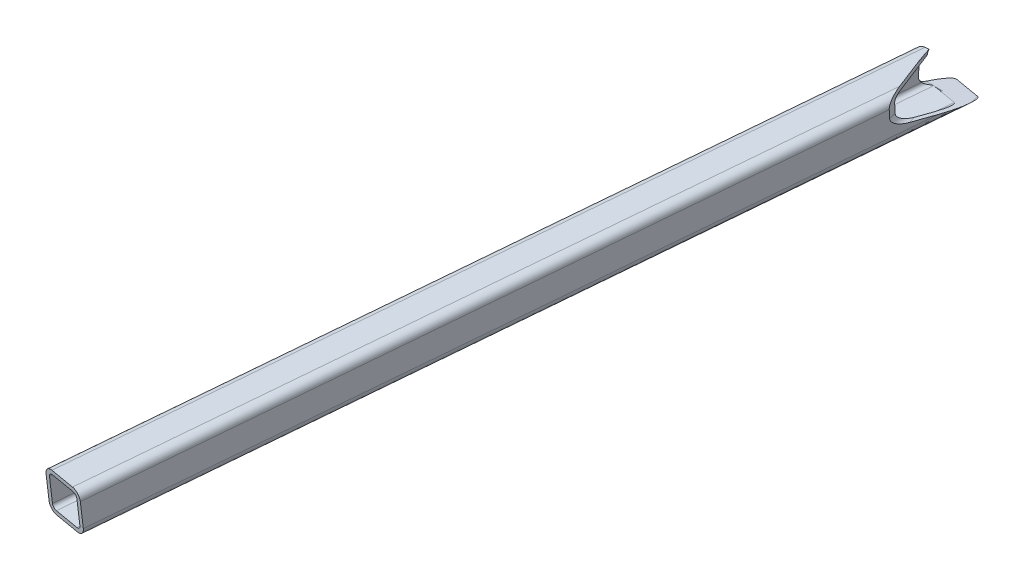
ISO-10303-21;
HEADER;
FILE_DESCRIPTION(('STEP AP214'),'2;1');
FILE_NAME('part.step','',(''),(''),'','','');
FILE_SCHEMA(('AUTOMOTIVE_DESIGN { 1 0 10303 214 1 1 1 1 }'));
ENDSEC;
DATA;
#1=APPLICATION_CONTEXT('core data for automotive mechanical design processes');
#2=APPLICATION_PROTOCOL_DEFINITION('international standard','automotive_design',2000,#1);
#3=PRODUCT_CONTEXT('',#1,'mechanical');
#4=PRODUCT('Part','Part','',(#3));
#5=PRODUCT_RELATED_PRODUCT_CATEGORY('part','',(#4));
#6=PRODUCT_DEFINITION_FORMATION('','',#4);
#7=PRODUCT_DEFINITION_CONTEXT('part definition',#1,'design');
#8=PRODUCT_DEFINITION('design','',#6,#7);
#9=PRODUCT_DEFINITION_SHAPE('','',#8);
#10=(LENGTH_UNIT() NAMED_UNIT(*) SI_UNIT(.MILLI.,.METRE.));
#11=(NAMED_UNIT(*) PLANE_ANGLE_UNIT() SI_UNIT($,.RADIAN.));
#12=(NAMED_UNIT(*) SI_UNIT($,.STERADIAN.) SOLID_ANGLE_UNIT());
#13=UNCERTAINTY_MEASURE_WITH_UNIT(LENGTH_MEASURE(1.E-05),#10,'distance_accuracy_value','');
#14=(GEOMETRIC_REPRESENTATION_CONTEXT(3) GLOBAL_UNCERTAINTY_ASSIGNED_CONTEXT((#13)) GLOBAL_UNIT_ASSIGNED_CONTEXT((#10,
#11,#12)) REPRESENTATION_CONTEXT('',''));
#15=CARTESIAN_POINT('',(0.,0.,0.));
#16=DIRECTION('',(0.,0.,1.));
#17=DIRECTION('',(1.,0.,0.));
#18=AXIS2_PLACEMENT_3D('',#15,#16,#17);
#19=CARTESIAN_POINT('',(54.1032900351574,-73.9281460624986,-1680.60116665924));
#20=DIRECTION('',(0.3292103133934,0.229015870186713,-0.916063480746854));
#21=DIRECTION('',(-0.941074716280074,0.,-0.338198726163152));
#22=AXIS2_PLACEMENT_3D('',#19,#20,#21);
#23=CYLINDRICAL_SURFACE('',#22,4.);
#24=CARTESIAN_POINT('',(165.293495766993,3.42156227269108,-1990.));
#25=DIRECTION('',(0.,0.,-1.));
#26=DIRECTION('',(0.820905201785488,0.5710644881986,0.));
#27=AXIS2_PLACEMENT_3D('',#24,#25,#26);
#28=ELLIPSE('',#27,4.36650961867715,4.);
#29=CARTESIAN_POINT('',(161.046510304216,3.24974629858509,-1990.));
#30=VERTEX_POINT('',#29);
#31=CARTESIAN_POINT('',(162.205924152796,6.00000000000001,-1990.));
#32=VERTEX_POINT('',#31);
#33=EDGE_CURVE('E529',#30,#32,#28,.T.);
#34=ORIENTED_EDGE('',*,*,#33,.F.);
#35=DIRECTION('',(0.3292103133934,0.229015870186713,-0.916063480746854));
#36=VECTOR('',#35,1.);
#37=CARTESIAN_POINT('',(50.3295443978832,-73.7707517232112,-1681.91800791281));
#38=LINE('',#37,#36);
#39=CARTESIAN_POINT('',(49.9999999999999,-73.9999999999996,-1681.00101480566));
#40=VERTEX_POINT('',#39);
#41=EDGE_CURVE('E271',#40,#30,#38,.T.);
#42=ORIENTED_EDGE('',*,*,#41,.F.);
#43=CARTESIAN_POINT('',(53.9999999999999,-73.9999999999996,-1680.31375090924));
#44=DIRECTION('',(-0.168171921974834,-0.116989163112928,0.978790958465303));
#45=DIRECTION('',(0.80349458926477,0.558952757749405,0.204861562101272));
#46=AXIS2_PLACEMENT_3D('',#43,#44,#45);
#47=ELLIPSE('',#46,4.08667444810873,4.);
#48=CARTESIAN_POINT('',(54.,-69.9999999999996,-1679.83565428564));
#49=VERTEX_POINT('',#48);
#50=EDGE_CURVE('E310',#49,#40,#47,.T.);
#51=ORIENTED_EDGE('',*,*,#50,.F.);
#52=DIRECTION('',(0.3292103133934,0.229015870186713,-0.916063480746854));
#53=VECTOR('',#52,1.);
#54=CARTESIAN_POINT('',(53.94589569587,-70.0376377767856,-1679.68510317849));
#55=LINE('',#54,#53);
#56=CARTESIAN_POINT('',(165.589697193477,7.62761543894062,-1990.3461160414));
#57=VERTEX_POINT('',#56);
#58=EDGE_CURVE('E274',#49,#57,#55,.T.);
#59=ORIENTED_EDGE('',*,*,#58,.T.);
#60=CARTESIAN_POINT('',(162.205924152796,6.00000000000001,-1990.));
#61=CARTESIAN_POINT('',(162.297465743592,6.10076571228071,-1990.00003387805));
#62=CARTESIAN_POINT('',(162.393493529026,6.19723632581698,-1990.00380646283));
#63=CARTESIAN_POINT('',(162.593031896537,6.38134727203628,-1990.01714341719));
#64=CARTESIAN_POINT('',(162.696529720715,6.4690020755013,-1990.02669810857));
#65=CARTESIAN_POINT('',(162.910387881736,6.6360115786466,-1990.04998536255));
#66=CARTESIAN_POINT('',(163.020781119878,6.71532072401796,-1990.06373940216));
#67=CARTESIAN_POINT('',(163.247124091024,6.86509701663771,-1990.09392167442));
#68=CARTESIAN_POINT('',(163.363076368465,6.93556006048673,-1990.11035114006));
#69=CARTESIAN_POINT('',(163.599098139199,7.06701379623975,-1990.14434717654));
#70=CARTESIAN_POINT('',(163.719137329081,7.12806100180455,-1990.16190598873));
#71=CARTESIAN_POINT('',(163.963541515791,7.24085913002823,-1990.19687569133));
#72=CARTESIAN_POINT('',(164.087906663519,7.29260972800839,-1990.21428657657));
#73=CARTESIAN_POINT('',(164.34001675291,7.3860288925307,-1990.2474845087));
#74=CARTESIAN_POINT('',(164.467746101468,7.42773714489657,-1990.26327780088));
#75=CARTESIAN_POINT('',(164.726489803195,7.50045626921022,-1990.29187946547));
#76=CARTESIAN_POINT('',(164.857501843146,7.53147445869022,-1990.30468987776));
#77=CARTESIAN_POINT('',(165.088591864016,7.57535323428185,-1990.32322337915));
#78=CARTESIAN_POINT('',(165.188095803454,7.59082324756153,-1990.3299198235));
#79=CARTESIAN_POINT('',(165.388208205971,7.61467927402099,-1990.34036302645));
#80=CARTESIAN_POINT('',(165.488817782183,7.62305732658316,-1990.34410647004));
#81=CARTESIAN_POINT('',(165.589697193477,7.62761543894065,-1990.3461160414));
#82=B_SPLINE_CURVE_WITH_KNOTS('',3,(#60,#61,#62,#63,#64,#65,#66,#67,#68,#69,#70,#71,#72,#73,#74,
#75,#76,#77,#78,#79,#80,#81),.UNSPECIFIED.,.F.,.F.,(4,2,2,2,2,2,2,2,2,2,4),(0.,
0.407989495698475,0.815297972147628,1.22472549541881,1.63434224163021,2.04139583532084,
2.44846364236362,2.85389535824419,3.2590489953317,3.56153390662927,3.86435790407479),.UNSPECIFIED.);
#83=EDGE_CURVE('E361',#32,#57,#82,.T.);
#84=ORIENTED_EDGE('',*,*,#83,.F.);
#85=EDGE_LOOP('',(#34,#42,#51,#59,#84));
#86=FACE_BOUND('',#85,.T.);
#87=ADVANCED_FACE('F41',(#86),#23,.T.);
#88=CARTESIAN_POINT('',(50.8017274157454,-85.4422765803505,-1684.66619835505));
#89=DIRECTION('',(0.943436409318581,-0.0393485848218571,0.329210313393401));
#90=DIRECTION('',(0.329465469723453,0.,-0.944167625085665));
#91=AXIS2_PLACEMENT_3D('',#88,#89,#90);
#92=PLANE('',#91);
#93=CARTESIAN_POINT('',(162.056516720495,-6.00000000000001,-1994.));
#94=DIRECTION('',(0.943436409318581,-0.0393485848218571,0.329210313393401));
#95=DIRECTION('',(-0.33155352746135,-0.111966498623447,0.936768787702676));
#96=AXIS2_PLACEMENT_3D('',#93,#94,#95);
#97=ELLIPSE('',#96,4.23981940965062,4.);
#98=CARTESIAN_POINT('',(160.948514442533,-8.81842473562879,-1991.16160573394));
#99=VERTEX_POINT('',#98);
#100=CARTESIAN_POINT('',(160.660724443912,-6.00000000000001,-1990.));
#101=VERTEX_POINT('',#100);
#102=EDGE_CURVE('E282',#99,#101,#97,.F.);
#103=ORIENTED_EDGE('',*,*,#102,.F.);
#104=DIRECTION('',(0.3292103133934,0.229015870186713,-0.916063480746854));
#105=VECTOR('',#104,1.);
#106=CARTESIAN_POINT('',(50.8017274157454,-85.4422765803505,-1684.66619835505));
#107=LINE('',#106,#105);
#108=CARTESIAN_POINT('',(50.,-85.9999999999995,-1682.43530467646));
#109=VERTEX_POINT('',#108);
#110=EDGE_CURVE('E268',#109,#99,#107,.T.);
#111=ORIENTED_EDGE('',*,*,#110,.F.);
#112=DIRECTION('',(0.,-0.992932622114171,-0.118679433523578));
#113=VECTOR('',#112,1.);
#114=CARTESIAN_POINT('',(50.,-85.7130220381919,-1682.40100387781));
#115=LINE('',#114,#113);
#116=EDGE_CURVE('E313',#40,#109,#115,.T.);
#117=ORIENTED_EDGE('',*,*,#116,.F.);
#118=ORIENTED_EDGE('',*,*,#41,.T.);
#119=DIRECTION('',(0.0416714946710183,0.999131366003432,0.));
#120=VECTOR('',#119,1.);
#121=CARTESIAN_POINT('',(157.162350004895,-89.8783360098117,-1990.));
#122=LINE('',#121,#120);
#123=EDGE_CURVE('E530',#101,#30,#122,.T.);
#124=ORIENTED_EDGE('',*,*,#123,.F.);
#125=EDGE_LOOP('',(#103,#111,#117,#118,#124));
#126=FACE_BOUND('',#125,.T.);
#127=ADVANCED_FACE('F357',(#126),#92,.F.);
#128=CARTESIAN_POINT('',(54.5754730530198,-85.599670919638,-1683.34935710148));
#129=DIRECTION('',(0.3292103133934,0.229015870186713,-0.916063480746854));
#130=DIRECTION('',(-0.941074716280074,0.,-0.338198726163152));
#131=AXIS2_PLACEMENT_3D('',#128,#129,#130);
#132=CYLINDRICAL_SURFACE('',#131,4.);
#133=CARTESIAN_POINT('',(162.373354768369,-10.,-1994.));
#134=CARTESIAN_POINT('',(162.312482268875,-9.99996135996605,-1993.87489935749));
#135=CARTESIAN_POINT('',(162.249658701786,-9.99413083001994,-1993.75081611515));
#136=CARTESIAN_POINT('',(162.12173329001,-9.97116634251973,-1993.5048445865));
#137=CARTESIAN_POINT('',(162.056630920958,-9.95402976696814,-1993.38295681528));
#138=CARTESIAN_POINT('',(161.924963897282,-9.90844383026138,-1993.14004928697));
#139=CARTESIAN_POINT('',(161.85839119264,-9.87985242714997,-1993.01906062743));
#140=CARTESIAN_POINT('',(161.726361952706,-9.81136374272717,-1992.77975927288));
#141=CARTESIAN_POINT('',(161.660905134617,-9.77146937244744,-1992.66144589734));
#142=CARTESIAN_POINT('',(161.498933104692,-9.65594730864718,-1992.36568495085));
#143=CARTESIAN_POINT('',(161.40433895344,-9.57258646007895,-1992.19012216393));
#144=CARTESIAN_POINT('',(161.230119248568,-9.37787345788967,-1991.8486771634));
#145=CARTESIAN_POINT('',(161.150391651847,-9.26672538979076,-1991.68273478606));
#146=CARTESIAN_POINT('',(161.056233979188,-9.09179670783814,-1991.46088297955));
#147=CARTESIAN_POINT('',(161.031590058566,-9.0403446638256,-1991.39945882488));
#148=CARTESIAN_POINT('',(160.986611280392,-8.93282345818923,-1991.27876866423));
#149=CARTESIAN_POINT('',(160.966289964395,-8.87674052937456,-1991.21950990842));
#150=CARTESIAN_POINT('',(160.948514442533,-8.81842473562867,-1991.16160573394));
#151=B_SPLINE_CURVE_WITH_KNOTS('',3,(#133,#134,#135,#136,#137,#138,#139,#140,#141,#142,#143,
#144,#145,#146,#147,#148,#149,#150),.UNSPECIFIED.,.F.,.F.,(4,2,2,2,2,2,2,2,4),(0.,
0.417149501995803,0.834395631925087,1.25698427573216,1.67946418239054,2.32580539550081,
2.9675322218104,3.21879294818066,3.47082957732747),.UNSPECIFIED.);
#152=CARTESIAN_POINT('',(162.373354768369,-10.,-1994.));
#153=VERTEX_POINT('',#152);
#154=EDGE_CURVE('E422',#153,#99,#151,.T.);
#155=ORIENTED_EDGE('',*,*,#154,.F.);
#156=CARTESIAN_POINT('',(163.249999999999,-10.,-1985.74804078003));
#157=DIRECTION('',(0.,1.,0.));
#158=DIRECTION('',(0.338198726163151,0.,-0.941074716280074));
#159=AXIS2_PLACEMENT_3D('',#156,#157,#158);
#160=ELLIPSE('',#159,17.4660384747086,4.);
#161=CARTESIAN_POINT('',(168.999999999999,-10.,-2002.22613740363));
#162=VERTEX_POINT('',#161);
#163=EDGE_CURVE('E231',#162,#153,#160,.T.);
#164=ORIENTED_EDGE('',*,*,#163,.F.);
#165=DIRECTION('',(0.3292103133934,0.229015870186713,-0.916063480746854));
#166=VECTOR('',#165,1.);
#167=CARTESIAN_POINT('',(54.7328673923072,-89.4901792053511,-1684.26542058223));
#168=LINE('',#167,#166);
#169=CARTESIAN_POINT('',(54.,-89.9999999999996,-1682.22613740363));
#170=VERTEX_POINT('',#169);
#171=EDGE_CURVE('E265',#170,#162,#168,.T.);
#172=ORIENTED_EDGE('',*,*,#171,.F.);
#173=CARTESIAN_POINT('',(54.,-85.9999999999995,-1681.74804078003));
#174=DIRECTION('',(-0.168171921974834,-0.116989163112928,0.978790958465303));
#175=DIRECTION('',(0.80349458926477,0.558952757749405,0.204861562101272));
#176=AXIS2_PLACEMENT_3D('',#173,#174,#175);
#177=ELLIPSE('',#176,4.08667444810873,4.);
#178=EDGE_CURVE('E316',#109,#170,#177,.T.);
#179=ORIENTED_EDGE('',*,*,#178,.F.);
#180=ORIENTED_EDGE('',*,*,#110,.T.);
#181=EDGE_LOOP('',(#155,#164,#172,#179,#180));
#182=FACE_BOUND('',#181,.T.);
#183=ADVANCED_FACE('F429',(#182),#132,.T.);
#184=CARTESIAN_POINT('',(54.1032900351574,-73.9281460624986,-1680.60116665924));
#185=DIRECTION('',(0.3292103133934,0.229015870186713,-0.916063480746854));
#186=DIRECTION('',(-0.941074716280074,0.,-0.338198726163152));
#187=AXIS2_PLACEMENT_3D('',#184,#185,#186);
#188=CYLINDRICAL_SURFACE('',#187,2.);
#189=DIRECTION('',(0.3292103133934,0.229015870186713,-0.916063480746854));
#190=VECTOR('',#189,1.);
#191=CARTESIAN_POINT('',(52.2164172165202,-73.849448892855,-1681.25958728603));
#192=LINE('',#191,#190);
#193=CARTESIAN_POINT('',(51.9999999999999,-73.9999999999995,-1680.65738285745));
#194=VERTEX_POINT('',#193);
#195=CARTESIAN_POINT('',(163.170003035604,3.33565428563821,-1990.));
#196=VERTEX_POINT('',#195);
#197=EDGE_CURVE('E259',#194,#196,#192,.T.);
#198=ORIENTED_EDGE('',*,*,#197,.T.);
#199=CARTESIAN_POINT('',(165.293495766993,3.42156227269108,-1990.));
#200=DIRECTION('',(0.,0.,-1.));
#201=DIRECTION('',(0.820905201785488,0.5710644881986,0.));
#202=AXIS2_PLACEMENT_3D('',#199,#200,#201);
#203=ELLIPSE('',#202,2.18325480933857,2.);
#204=CARTESIAN_POINT('',(165.379403754046,5.481324350641,-1990.));
#205=VERTEX_POINT('',#204);
#206=EDGE_CURVE('E535',#196,#205,#203,.T.);
#207=ORIENTED_EDGE('',*,*,#206,.T.);
#208=DIRECTION('',(0.3292103133934,0.229015870186713,-0.916063480746854));
#209=VECTOR('',#208,1.);
#210=CARTESIAN_POINT('',(54.0245928655138,-71.9828919196421,-1680.14313491887));
#211=LINE('',#210,#209);
#212=CARTESIAN_POINT('',(54.,-71.9999999999996,-1680.07470259744));
#213=VERTEX_POINT('',#212);
#214=EDGE_CURVE('E256',#213,#205,#211,.T.);
#215=ORIENTED_EDGE('',*,*,#214,.F.);
#216=CARTESIAN_POINT('',(53.9999999999999,-73.9999999999996,-1680.31375090924));
#217=DIRECTION('',(-0.168171921974834,-0.116989163112928,0.978790958465303));
#218=DIRECTION('',(0.80349458926477,0.558952757749405,0.204861562101272));
#219=AXIS2_PLACEMENT_3D('',#216,#217,#218);
#220=ELLIPSE('',#219,2.04333722405436,2.);
#221=EDGE_CURVE('E215',#213,#194,#220,.T.);
#222=ORIENTED_EDGE('',*,*,#221,.T.);
#223=EDGE_LOOP('',(#198,#207,#215,#222));
#224=FACE_BOUND('',#223,.T.);
#225=ADVANCED_FACE('F432',(#224),#188,.F.);
#226=CARTESIAN_POINT('',(65.3458297773367,-72.4550749375045,-1676.19261115815));
#227=DIRECTION('',(0.039348584821857,-0.972627071428274,-0.229015870186713));
#228=DIRECTION('',(0.,0.229193370242402,-0.973380911584426));
#229=AXIS2_PLACEMENT_3D('',#226,#227,#228);
#230=PLANE('',#229);
#231=ORIENTED_EDGE('',*,*,#214,.T.);
#232=DIRECTION('',(0.999182659857195,0.0404229172710405,0.));
#233=VECTOR('',#232,1.);
#234=CARTESIAN_POINT('',(62.361444202839,1.31363147157816,-1990.));
#235=LINE('',#234,#233);
#236=CARTESIAN_POINT('',(167.192235935956,5.55466425960822,-1990.));
#237=VERTEX_POINT('',#236);
#238=EDGE_CURVE('E370',#205,#237,#235,.T.);
#239=ORIENTED_EDGE('',*,*,#238,.T.);
#240=DIRECTION('',(0.23693954245657,-0.21357458825435,0.947758169826278));
#241=VECTOR('',#240,1.);
#242=CARTESIAN_POINT('',(235.89119143438,-56.3697869398757,-1715.2041780063));
#243=LINE('',#242,#241);
#244=CARTESIAN_POINT('',(171.675568943719,1.51343926519606,-1972.06666796895));
#245=VERTEX_POINT('',#244);
#246=EDGE_CURVE('E65',#237,#245,#243,.T.);
#247=ORIENTED_EDGE('',*,*,#246,.T.);
#248=DIRECTION('',(0.3292103133934,0.229015870186713,-0.916063480746854));
#249=VECTOR('',#248,1.);
#250=CARTESIAN_POINT('',(65.3458297773367,-72.4550749375045,-1676.19261115815));
#251=LINE('',#250,#249);
#252=CARTESIAN_POINT('',(65.9999999999999,-71.9999999999996,-1678.01291090817));
#253=VERTEX_POINT('',#252);
#254=EDGE_CURVE('E218',#253,#245,#251,.T.);
#255=ORIENTED_EDGE('',*,*,#254,.F.);
#256=DIRECTION('',(-0.985558600813724,0.,-0.169334711037329));
#257=VECTOR('',#256,1.);
#258=CARTESIAN_POINT('',(65.668376130421,-71.9999999999996,-1678.06988918635));
#259=LINE('',#258,#257);
#260=EDGE_CURVE('E214',#253,#213,#259,.T.);
#261=ORIENTED_EDGE('',*,*,#260,.T.);
#262=EDGE_LOOP('',(#231,#239,#247,#255,#261));
#263=FACE_BOUND('',#262,.T.);
#264=ADVANCED_FACE('F402',(#263),#230,.T.);
#265=CARTESIAN_POINT('',(54.5754730530198,-85.599670919638,-1683.34935710148));
#266=DIRECTION('',(0.3292103133934,0.229015870186713,-0.916063480746854));
#267=DIRECTION('',(-0.941074716280074,0.,-0.338198726163152));
#268=AXIS2_PLACEMENT_3D('',#265,#266,#267);
#269=CYLINDRICAL_SURFACE('',#268,2.);
#270=DIRECTION('',(0.3292103133934,0.229015870186713,-0.916063480746854));
#271=VECTOR('',#270,1.);
#272=CARTESIAN_POINT('',(54.6541702226635,-87.5449250624946,-1683.80738884185));
#273=LINE('',#272,#271);
#274=CARTESIAN_POINT('',(54.,-87.9999999999996,-1681.98708909183));
#275=VERTEX_POINT('',#274);
#276=CARTESIAN_POINT('',(166.12502957188,-9.99997942825694,-1993.98717137881));
#277=VERTEX_POINT('',#276);
#278=EDGE_CURVE('E246',#275,#277,#273,.T.);
#279=ORIENTED_EDGE('',*,*,#278,.T.);
#280=CARTESIAN_POINT('',(166.12502957188,-9.99997942825689,-1993.9871713788));
#281=CARTESIAN_POINT('',(166.090832301568,-9.99998274533252,-1993.99307540209));
#282=CARTESIAN_POINT('',(166.056281402746,-9.99999345015904,-1993.99510049495));
#283=CARTESIAN_POINT('',(165.988035871068,-9.99999749670629,-1993.99291413077));
#284=CARTESIAN_POINT('',(165.954338085634,-9.99999118622444,-1993.98882834581));
#285=CARTESIAN_POINT('',(165.868213294209,-9.99991413885473,-1993.97227336039));
#286=CARTESIAN_POINT('',(165.816526796986,-9.99980742384238,-1993.95627003266));
#287=CARTESIAN_POINT('',(165.715323895994,-9.99919431416959,-1993.91735226319));
#288=CARTESIAN_POINT('',(165.665842462472,-9.9986829668108,-1993.89435436972));
#289=CARTESIAN_POINT('',(165.574463932306,-9.99713504881506,-1993.84699260801));
#290=CARTESIAN_POINT('',(165.532335064213,-9.99616315875271,-1993.82306453568));
#291=CARTESIAN_POINT('',(165.449445701829,-9.99363040923188,-1993.77295679707));
#292=CARTESIAN_POINT('',(165.408685946223,-9.99206923722166,-1993.74677594163));
#293=CARTESIAN_POINT('',(165.287890854828,-9.9863775366616,-1993.66576604655));
#294=CARTESIAN_POINT('',(165.209502074776,-9.98124096426784,-1993.60856087839));
#295=CARTESIAN_POINT('',(165.055644076079,-9.96785331357349,-1993.49038401799));
#296=CARTESIAN_POINT('',(164.980182611202,-9.95959451382815,-1993.42940330384));
#297=CARTESIAN_POINT('',(164.831883938573,-9.93966881324213,-1993.30503796889));
#298=CARTESIAN_POINT('',(164.759043895097,-9.92800572757722,-1993.24165610786));
#299=CARTESIAN_POINT('',(164.572879825692,-9.89293117776804,-1993.07475218522));
#300=CARTESIAN_POINT('',(164.461322876497,-9.86666159961758,-1992.96983730794));
#301=CARTESIAN_POINT('',(164.244157733193,-9.80353237978298,-1992.75681177822));
#302=CARTESIAN_POINT('',(164.138556031863,-9.7666614369955,-1992.64869782648));
#303=CARTESIAN_POINT('',(163.935075445121,-9.68116310775654,-1992.43070125736));
#304=CARTESIAN_POINT('',(163.837166514019,-9.63258481929263,-1992.32082776992));
#305=CARTESIAN_POINT('',(163.650943691838,-9.52203566120948,-1992.09986980389));
#306=CARTESIAN_POINT('',(163.562614615833,-9.46008646599044,-1991.98878755824));
#307=CARTESIAN_POINT('',(163.402388071814,-9.32380309908267,-1991.77106270901));
#308=CARTESIAN_POINT('',(163.329960190146,-9.25009080396752,-1991.66442750161));
#309=CARTESIAN_POINT('',(163.202254427947,-9.08720948232678,-1991.45309090017));
#310=CARTESIAN_POINT('',(163.146891458279,-8.99812071657393,-1991.34838244271));
#311=CARTESIAN_POINT('',(163.092688836746,-8.87684633257742,-1991.22060959657));
#312=CARTESIAN_POINT('',(163.082577319731,-8.85203484641144,-1991.19515077792));
#313=CARTESIAN_POINT('',(163.063985852239,-8.8014027795115,-1991.14458041183));
#314=CARTESIAN_POINT('',(163.055507870666,-8.77558102562049,-1991.1194693169));
#315=CARTESIAN_POINT('',(163.047918220643,-8.7492742812918,-1991.09457560308));
#316=B_SPLINE_CURVE_WITH_KNOTS('',3,(#280,#281,#282,#283,#284,#285,#286,#287,#288,#289,#290,
#291,#292,#293,#294,#295,#296,#297,#298,#299,#300,#301,#302,#303,#304,#305,#306,#307,#308,#309,
#310,#311,#312,#313,#314,#315),.UNSPECIFIED.,.F.,.F.,(4,2,2,2,2,2,2,2,2,2,2,2,2,2,2,2,2,4),(0.,
0.103445936670636,0.204793523409739,0.366226596349894,0.529666757431471,0.674944469666773,
0.820299344884104,1.11156576403731,1.40355726423316,1.69522277843929,2.16085666987658,
2.62698878124058,3.09119905323658,3.55466241180509,3.99886010411777,4.44080570378757,
4.55164341572952,4.66261389622955),.UNSPECIFIED.);
#317=CARTESIAN_POINT('',(163.047918220643,-8.74927428129176,-1991.09457560308));
#318=VERTEX_POINT('',#317);
#319=EDGE_CURVE('E406',#277,#318,#316,.T.);
#320=ORIENTED_EDGE('',*,*,#319,.T.);
#321=DIRECTION('',(0.3292103133934,0.229015870186713,-0.916063480746854));
#322=VECTOR('',#321,1.);
#323=CARTESIAN_POINT('',(52.6886002343826,-85.5209737499942,-1684.00777772827));
#324=LINE('',#323,#322);
#325=CARTESIAN_POINT('',(51.9999999999999,-85.9999999999996,-1682.09167272825));
#326=VERTEX_POINT('',#325);
#327=EDGE_CURVE('E242',#326,#318,#324,.T.);
#328=ORIENTED_EDGE('',*,*,#327,.F.);
#329=CARTESIAN_POINT('',(54.,-85.9999999999995,-1681.74804078003));
#330=DIRECTION('',(-0.168171921974834,-0.116989163112928,0.978790958465303));
#331=DIRECTION('',(0.80349458926477,0.558952757749405,0.204861562101272));
#332=AXIS2_PLACEMENT_3D('',#329,#330,#331);
#333=ELLIPSE('',#332,2.04333722405436,2.);
#334=EDGE_CURVE('E245',#326,#275,#333,.T.);
#335=ORIENTED_EDGE('',*,*,#334,.T.);
#336=EDGE_LOOP('',(#279,#320,#328,#335));
#337=FACE_BOUND('',#336,.T.);
#338=ADVANCED_FACE('F397',(#337),#269,.F.);
#339=CARTESIAN_POINT('',(52.6886002343826,-85.5209737499942,-1684.00777772827));
#340=DIRECTION('',(0.943436409318581,-0.0393485848218571,0.329210313393401));
#341=DIRECTION('',(0.329465469723453,0.,-0.944167625085665));
#342=AXIS2_PLACEMENT_3D('',#339,#340,#341);
#343=PLANE('',#342);
#344=ORIENTED_EDGE('',*,*,#327,.T.);
#345=CARTESIAN_POINT('',(164.17642642532,-6.00000000000001,-1994.));
#346=DIRECTION('',(0.943436409318581,-0.0393485848218571,0.329210313393401));
#347=DIRECTION('',(-0.33155352746135,-0.111966498623447,0.936768787702676));
#348=AXIS2_PLACEMENT_3D('',#345,#346,#347);
#349=ELLIPSE('',#348,4.23981940965062,4.);
#350=CARTESIAN_POINT('',(162.780634148737,-5.99999999999999,-1990.));
#351=VERTEX_POINT('',#350);
#352=EDGE_CURVE('E414',#318,#351,#349,.F.);
#353=ORIENTED_EDGE('',*,*,#352,.T.);
#354=DIRECTION('',(0.0416714946710183,0.999131366003432,0.));
#355=VECTOR('',#354,1.);
#356=CARTESIAN_POINT('',(159.278578457966,-89.9665990808207,-1990.));
#357=LINE('',#356,#355);
#358=EDGE_CURVE('E531',#351,#196,#357,.T.);
#359=ORIENTED_EDGE('',*,*,#358,.T.);
#360=ORIENTED_EDGE('',*,*,#197,.F.);
#361=DIRECTION('',(0.,-0.992932622114171,-0.118679433523578));
#362=VECTOR('',#361,1.);
#363=CARTESIAN_POINT('',(51.9999999999999,-85.7535158610237,-1682.06221191959));
#364=LINE('',#363,#362);
#365=EDGE_CURVE('E103',#194,#326,#364,.T.);
#366=ORIENTED_EDGE('',*,*,#365,.T.);
#367=EDGE_LOOP('',(#344,#353,#359,#360,#366));
#368=FACE_BOUND('',#367,.T.);
#369=ADVANCED_FACE('F394',(#368),#343,.T.);
#370=CARTESIAN_POINT('',(169.179144999128,5.99999999999999,-1998.54478624978));
#371=DIRECTION('',(0.242535625036333,0.,0.970142500145332));
#372=DIRECTION('',(0.970142500145332,0.,-0.242535625036333));
#373=AXIS2_PLACEMENT_3D('',#370,#371,#372);
#374=CYLINDRICAL_SURFACE('',#373,4.);
#375=DIRECTION('',(0.242535625036333,0.,0.970142500145332));
#376=VECTOR('',#375,1.);
#377=CARTESIAN_POINT('',(165.298574998547,6.00000000000001,-1997.57464374964));
#378=LINE('',#377,#376);
#379=CARTESIAN_POINT('',(167.192235935956,6.00000000000001,-1990.));
#380=VERTEX_POINT('',#379);
#381=CARTESIAN_POINT('',(168.979424006221,6.,-1982.85124771894));
#382=VERTEX_POINT('',#381);
#383=EDGE_CURVE('E225',#380,#382,#378,.T.);
#384=ORIENTED_EDGE('',*,*,#383,.F.);
#385=CARTESIAN_POINT('',(170.315341561574,6.00000000000001,-1994.));
#386=DIRECTION('',(0.788205438016109,0.,0.615412209402636));
#387=DIRECTION('',(-0.615412209402636,0.,0.788205438016109));
#388=AXIS2_PLACEMENT_3D('',#385,#386,#387);
#389=ELLIPSE('',#388,5.07481908532361,4.);
#390=CARTESIAN_POINT('',(167.49347955601,7.713984913022,-1990.38582572115));
#391=VERTEX_POINT('',#390);
#392=EDGE_CURVE('E521',#380,#391,#389,.F.);
#393=ORIENTED_EDGE('',*,*,#392,.T.);
#394=CARTESIAN_POINT('',(173.287582232397,6.00000000000001,-1982.11103731671));
#395=DIRECTION('',(0.039348584821857,-0.972627071428274,-0.229015870186713));
#396=DIRECTION('',(0.256774468722984,-0.21165431976974,0.943010774665294));
#397=AXIS2_PLACEMENT_3D('',#394,#395,#396);
#398=ELLIPSE('',#397,18.8116143333803,4.);
#399=EDGE_CURVE('E91',#391,#382,#398,.F.);
#400=ORIENTED_EDGE('',*,*,#399,.T.);
#401=EDGE_LOOP('',(#384,#393,#400));
#402=FACE_BOUND('',#401,.T.);
#403=ADVANCED_FACE('F43',(#402),#374,.F.);
#404=CARTESIAN_POINT('',(169.179144999128,-6.00000000000002,-1998.54478624978));
#405=DIRECTION('',(0.242535625036333,0.,0.970142500145332));
#406=DIRECTION('',(0.970142500145332,0.,-0.242535625036333));
#407=AXIS2_PLACEMENT_3D('',#404,#405,#406);
#408=CYLINDRICAL_SURFACE('',#407,4.);
#409=DIRECTION('',(0.242535625036333,0.,0.970142500145332));
#410=VECTOR('',#409,1.);
#411=CARTESIAN_POINT('',(169.179144999128,-10.,-1998.54478624978));
#412=LINE('',#411,#410);
#413=CARTESIAN_POINT('',(170.315341561574,-10.,-1994.));
#414=VERTEX_POINT('',#413);
#415=CARTESIAN_POINT('',(170.506784428596,-10.,-1993.23422853191));
#416=VERTEX_POINT('',#415);
#417=EDGE_CURVE('E193',#414,#416,#412,.T.);
#418=ORIENTED_EDGE('',*,*,#417,.F.);
#419=CARTESIAN_POINT('',(170.315341561574,-6.00000000000001,-1994.));
#420=DIRECTION('',(0.788205438016109,0.,0.615412209402636));
#421=DIRECTION('',(-0.615412209402636,0.,0.788205438016109));
#422=AXIS2_PLACEMENT_3D('',#419,#420,#421);
#423=ELLIPSE('',#422,5.07481908532361,4.);
#424=CARTESIAN_POINT('',(169.909817745132,-9.96613651711611,-1993.48061466367));
#425=VERTEX_POINT('',#424);
#426=EDGE_CURVE('E11',#414,#425,#423,.F.);
#427=ORIENTED_EDGE('',*,*,#426,.T.);
#428=CARTESIAN_POINT('',(166.069186409221,-6.00000000000002,-2010.98462060941));
#429=DIRECTION('',(-0.039348584821857,0.972627071428274,0.229015870186713));
#430=DIRECTION('',(0.256774468722984,-0.21165431976974,0.943010774665294));
#431=AXIS2_PLACEMENT_3D('',#428,#429,#430);
#432=ELLIPSE('',#431,18.8116143333803,4.);
#433=EDGE_CURVE('E208',#416,#425,#432,.F.);
#434=ORIENTED_EDGE('',*,*,#433,.F.);
#435=EDGE_LOOP('',(#418,#427,#434));
#436=FACE_BOUND('',#435,.T.);
#437=ADVANCED_FACE('F348',(#436),#408,.F.);
#438=CARTESIAN_POINT('',(65.4245269469804,-74.400329080361,-1676.65064289852));
#439=DIRECTION('',(0.3292103133934,0.229015870186713,-0.916063480746854));
#440=DIRECTION('',(-0.941074716280074,0.,-0.338198726163152));
#441=AXIS2_PLACEMENT_3D('',#438,#439,#440);
#442=CYLINDRICAL_SURFACE('',#441,4.);
#443=CARTESIAN_POINT('',(171.640324641338,-0.511078510373068,-1972.20764517847));
#444=DIRECTION('',(0.970142500145332,0.,-0.242535625036333));
#445=DIRECTION('',(-0.233362342981096,0.272422992664626,-0.933449371924382));
#446=AXIS2_PLACEMENT_3D('',#443,#444,#445);
#447=ELLIPSE('',#446,7.38608425562313,4.);
#448=CARTESIAN_POINT('',(171.7108132461,3.53795704076536,-1971.92569075943));
#449=VERTEX_POINT('',#448);
#450=CARTESIAN_POINT('',(173.382677651708,-2.08161554663735,-1965.23823313699));
#451=VERTEX_POINT('',#450);
#452=EDGE_CURVE('E224',#449,#451,#447,.T.);
#453=ORIENTED_EDGE('',*,*,#452,.F.);
#454=DIRECTION('',(0.3292103133934,0.229015870186713,-0.916063480746854));
#455=VECTOR('',#454,1.);
#456=CARTESIAN_POINT('',(65.267132607693,-70.5098207946479,-1675.73457941777));
#457=LINE('',#456,#455);
#458=CARTESIAN_POINT('',(66.,-69.9999999999995,-1677.77386259637));
#459=VERTEX_POINT('',#458);
#460=EDGE_CURVE('E277',#459,#449,#457,.T.);
#461=ORIENTED_EDGE('',*,*,#460,.F.);
#462=CARTESIAN_POINT('',(66.,-73.9999999999996,-1678.25195921997));
#463=DIRECTION('',(-0.168171921974834,-0.116989163112928,0.978790958465303));
#464=DIRECTION('',(0.80349458926477,0.558952757749405,0.204861562101272));
#465=AXIS2_PLACEMENT_3D('',#462,#463,#464);
#466=ELLIPSE('',#465,4.08667444810873,4.);
#467=CARTESIAN_POINT('',(70.,-73.9999999999996,-1677.56469532354));
#468=VERTEX_POINT('',#467);
#469=EDGE_CURVE('E293',#468,#459,#466,.T.);
#470=ORIENTED_EDGE('',*,*,#469,.F.);
#471=DIRECTION('',(0.3292103133934,0.229015870186713,-0.916063480746854));
#472=VECTOR('',#471,1.);
#473=CARTESIAN_POINT('',(69.1982725842548,-74.5577234196484,-1675.33380164495));
#474=LINE('',#473,#472);
#475=EDGE_CURVE('E280',#468,#451,#474,.T.);
#476=ORIENTED_EDGE('',*,*,#475,.T.);
#477=EDGE_LOOP('',(#453,#461,#470,#476));
#478=FACE_BOUND('',#477,.T.);
#479=ADVANCED_FACE('F344',(#478),#442,.T.);
#480=CARTESIAN_POINT('',(65.267132607693,-70.5098207946479,-1675.73457941777));
#481=DIRECTION('',(0.039348584821857,-0.972627071428274,-0.229015870186713));
#482=DIRECTION('',(0.,0.229193370242402,-0.973380911584426));
#483=AXIS2_PLACEMENT_3D('',#480,#481,#482);
#484=PLANE('',#483);
#485=CARTESIAN_POINT('',(104.091672217889,6.00000000000001,-1994.));
#486=DIRECTION('',(0.039348584821857,-0.972627071428274,-0.229015870186713));
#487=DIRECTION('',(-0.999225544545634,-0.0383011613634563,-0.00901843476959063));
#488=AXIS2_PLACEMENT_3D('',#485,#486,#487);
#489=ELLIPSE('',#488,101.655498364407,4.);
#490=EDGE_CURVE('E371',#57,#391,#489,.F.);
#491=ORIENTED_EDGE('',*,*,#490,.F.);
#492=ORIENTED_EDGE('',*,*,#58,.F.);
#493=DIRECTION('',(-0.985558600813724,0.,-0.169334711037329));
#494=VECTOR('',#493,1.);
#495=CARTESIAN_POINT('',(65.6284815295694,-69.9999999999995,-1677.83769540426));
#496=LINE('',#495,#494);
#497=EDGE_CURVE('E307',#459,#49,#496,.T.);
#498=ORIENTED_EDGE('',*,*,#497,.F.);
#499=ORIENTED_EDGE('',*,*,#460,.T.);
#500=DIRECTION('',(0.23693954245657,-0.21357458825435,0.947758169826278));
#501=VECTOR('',#500,1.);
#502=CARTESIAN_POINT('',(235.995248306141,-54.4072960257568,-1714.78795051926));
#503=LINE('',#502,#501);
#504=EDGE_CURVE('E222',#382,#449,#503,.T.);
#505=ORIENTED_EDGE('',*,*,#504,.F.);
#506=ORIENTED_EDGE('',*,*,#399,.F.);
#507=EDGE_LOOP('',(#491,#492,#498,#499,#505,#506));
#508=FACE_BOUND('',#507,.T.);
#509=ADVANCED_FACE('F347',(#508),#484,.F.);
#510=CARTESIAN_POINT('',(54.7328673923072,-89.4901792053511,-1684.26542058223));
#511=DIRECTION('',(-0.039348584821857,0.972627071428274,0.229015870186713));
#512=DIRECTION('',(0.,-0.229193370242402,0.973380911584426));
#513=AXIS2_PLACEMENT_3D('',#510,#511,#512);
#514=PLANE('',#513);
#515=DIRECTION('',(-0.985558600813724,0.,-0.169334711037329));
#516=VECTOR('',#515,1.);
#517=CARTESIAN_POINT('',(111.073626453398,-10.,-2012.17881370097));
#518=LINE('',#517,#516);
#519=CARTESIAN_POINT('',(180.999999999999,-10.,-2000.16434571436));
#520=VERTEX_POINT('',#519);
#521=EDGE_CURVE('E236',#520,#162,#518,.T.);
#522=ORIENTED_EDGE('',*,*,#521,.F.);
#523=DIRECTION('',(0.3292103133934,0.229015870186713,-0.916063480746854));
#524=VECTOR('',#523,1.);
#525=CARTESIAN_POINT('',(66.0541043041302,-89.9623622232134,-1680.31489682151));
#526=LINE('',#525,#524);
#527=CARTESIAN_POINT('',(66.,-89.9999999999997,-1680.16434571436));
#528=VERTEX_POINT('',#527);
#529=EDGE_CURVE('E262',#528,#520,#526,.T.);
#530=ORIENTED_EDGE('',*,*,#529,.F.);
#531=DIRECTION('',(0.985558600813724,0.,0.169334711037329));
#532=VECTOR('',#531,1.);
#533=CARTESIAN_POINT('',(54.3715184704307,-89.9999999999996,-1682.16230459574));
#534=LINE('',#533,#532);
#535=EDGE_CURVE('E319',#170,#528,#534,.T.);
#536=ORIENTED_EDGE('',*,*,#535,.F.);
#537=ORIENTED_EDGE('',*,*,#171,.T.);
#538=EDGE_LOOP('',(#522,#530,#536,#537));
#539=FACE_BOUND('',#538,.T.);
#540=ADVANCED_FACE('F352',(#539),#514,.F.);
#541=CARTESIAN_POINT('',(65.8967099648428,-86.0718539375003,-1679.39883334076));
#542=DIRECTION('',(0.3292103133934,0.229015870186713,-0.916063480746854));
#543=DIRECTION('',(-0.941074716280074,0.,-0.338198726163152));
#544=AXIS2_PLACEMENT_3D('',#541,#542,#543);
#545=CYLINDRICAL_SURFACE('',#544,4.);
#546=CARTESIAN_POINT('',(175.249999999999,-10.,-1983.68624909076));
#547=DIRECTION('',(0.,1.,0.));
#548=DIRECTION('',(0.338198726163151,0.,-0.941074716280074));
#549=AXIS2_PLACEMENT_3D('',#546,#547,#548);
#550=ELLIPSE('',#549,17.4660384747086,4.);
#551=CARTESIAN_POINT('',(181.153579698132,-10.,-2000.12431496118));
#552=VERTEX_POINT('',#551);
#553=EDGE_CURVE('E446',#552,#520,#550,.T.);
#554=ORIENTED_EDGE('',*,*,#553,.F.);
#555=CARTESIAN_POINT('',(182.224390049881,-10.,-1995.84107355418));
#556=CARTESIAN_POINT('',(182.231424718943,-10.0000026860394,-1995.96221448319));
#557=CARTESIAN_POINT('',(182.237965242142,-9.99950843390262,-1996.08338531029));
#558=CARTESIAN_POINT('',(182.249863544548,-9.99762310105956,-1996.32578989575));
#559=CARTESIAN_POINT('',(182.255221206397,-9.99623193141821,-1996.44702365917));
#560=CARTESIAN_POINT('',(182.264538384756,-9.99265732162724,-1996.68902734237));
#561=CARTESIAN_POINT('',(182.26850364112,-9.99047721107103,-1996.80979708715));
#562=CARTESIAN_POINT('',(182.274756183161,-9.98545019501888,-1997.0513618028));
#563=CARTESIAN_POINT('',(182.277043550725,-9.98260332207188,-1997.17215677215));
#564=CARTESIAN_POINT('',(182.279924926885,-9.97529669920136,-1997.45703926133));
#565=CARTESIAN_POINT('',(182.279618590802,-9.97062452928949,-1997.62113143947));
#566=CARTESIAN_POINT('',(182.273157445751,-9.9609520231923,-1997.94986480102));
#567=CARTESIAN_POINT('',(182.266980625721,-9.95595051789524,-1998.11450572588));
#568=CARTESIAN_POINT('',(182.250102509879,-9.94909831358629,-1998.36165901951));
#569=CARTESIAN_POINT('',(182.243164179446,-9.94691513391627,-1998.44440872802));
#570=CARTESIAN_POINT('',(182.225720095745,-9.94303901015148,-1998.60953235806));
#571=CARTESIAN_POINT('',(182.215215569298,-9.94134589783746,-1998.69190639896));
#572=CARTESIAN_POINT('',(182.189220603762,-9.93880866683155,-1998.8556554795));
#573=CARTESIAN_POINT('',(182.173745673021,-9.93796194065338,-1998.9370328197));
#574=CARTESIAN_POINT('',(182.135603187764,-9.9375986069486,-1999.0980340364));
#575=CARTESIAN_POINT('',(182.112947737867,-9.93807977136519,-1999.17766062441));
#576=CARTESIAN_POINT('',(182.057478909957,-9.94092697387336,-1999.33290619173));
#577=CARTESIAN_POINT('',(182.024729278214,-9.94328132604725,-1999.40854692735));
#578=CARTESIAN_POINT('',(181.946132481753,-9.95011057767396,-1999.55222710027));
#579=CARTESIAN_POINT('',(181.900372791944,-9.95457144183859,-1999.62031321821));
#580=CARTESIAN_POINT('',(181.795161183804,-9.96481898432471,-1999.74550696802));
#581=CARTESIAN_POINT('',(181.735633488608,-9.97061299914253,-1999.80255050804));
#582=CARTESIAN_POINT('',(181.606278046566,-9.98166743278235,-1999.90443156397));
#583=CARTESIAN_POINT('',(181.53636574557,-9.98692280844338,-1999.94915935384));
#584=CARTESIAN_POINT('',(181.413700920664,-9.99383202995381,-2000.01571730903));
#585=CARTESIAN_POINT('',(181.36241784318,-9.99609818720272,-2000.04033417457));
#586=CARTESIAN_POINT('',(181.258761872708,-9.99918100276681,-2000.08520767279));
#587=CARTESIAN_POINT('',(181.206413777097,-10.0000172279346,-2000.10551977627));
#588=CARTESIAN_POINT('',(181.153579698132,-10.,-2000.12431496118));
#589=B_SPLINE_CURVE_WITH_KNOTS('',3,(#555,#556,#557,#558,#559,#560,#561,#562,#563,#564,#565,
#566,#567,#568,#569,#570,#571,#572,#573,#574,#575,#576,#577,#578,#579,#580,#581,#582,#583,#584,
#585,#586,#587,#588),.UNSPECIFIED.,.F.,.F.,(4,2,2,2,2,2,2,2,2,2,2,2,2,2,2,2,4),(0.,
0.364034805945981,0.728105713798188,1.09065770571632,1.45319200283416,1.9456184714474,
2.43989858077691,2.68905154184762,2.93811887762109,3.18641651750892,3.43429779422329,
3.68064467098081,3.92537285786479,4.17148146575593,4.41971659597523,4.59033613606124,
4.7586017004484),.UNSPECIFIED.);
#590=CARTESIAN_POINT('',(182.224390049881,-10.,-1995.84107355418));
#591=VERTEX_POINT('',#590);
#592=EDGE_CURVE('E232',#591,#552,#589,.T.);
#593=ORIENTED_EDGE('',*,*,#592,.F.);
#594=CARTESIAN_POINT('',(179.249999999999,-10.,-1982.99898519434));
#595=VERTEX_POINT('',#594);
#596=EDGE_CURVE('E206',#595,#591,#550,.T.);
#597=ORIENTED_EDGE('',*,*,#596,.F.);
#598=DIRECTION('',(0.3292103133934,0.229015870186713,-0.916063480746854));
#599=VECTOR('',#598,1.);
#600=CARTESIAN_POINT('',(69.670455602117,-86.2292482767877,-1678.08199208719));
#601=LINE('',#600,#599);
#602=CARTESIAN_POINT('',(70.,-85.9999999999996,-1678.99898519434));
#603=VERTEX_POINT('',#602);
#604=EDGE_CURVE('E238',#603,#595,#601,.T.);
#605=ORIENTED_EDGE('',*,*,#604,.F.);
#606=CARTESIAN_POINT('',(66.,-85.9999999999996,-1679.68624909076));
#607=DIRECTION('',(-0.168171921974834,-0.116989163112928,0.978790958465303));
#608=DIRECTION('',(0.80349458926477,0.558952757749405,0.204861562101272));
#609=AXIS2_PLACEMENT_3D('',#606,#607,#608);
#610=ELLIPSE('',#609,4.08667444810873,4.);
#611=EDGE_CURVE('E322',#528,#603,#610,.T.);
#612=ORIENTED_EDGE('',*,*,#611,.F.);
#613=ORIENTED_EDGE('',*,*,#529,.T.);
#614=EDGE_LOOP('',(#554,#593,#597,#605,#612,#613));
#615=FACE_BOUND('',#614,.T.);
#616=ADVANCED_FACE('F334',(#615),#545,.T.);
#617=CARTESIAN_POINT('',(65.4245269469804,-74.400329080361,-1676.65064289852));
#618=DIRECTION('',(0.3292103133934,0.229015870186713,-0.916063480746854));
#619=DIRECTION('',(-0.941074716280074,0.,-0.338198726163152));
#620=AXIS2_PLACEMENT_3D('',#617,#618,#619);
#621=CYLINDRICAL_SURFACE('',#620,2.);
#622=ORIENTED_EDGE('',*,*,#254,.T.);
#623=CARTESIAN_POINT('',(171.640324641338,-0.511078510373068,-1972.20764517847));
#624=DIRECTION('',(0.970142500145332,0.,-0.242535625036333));
#625=DIRECTION('',(-0.233362342981096,0.272422992664626,-0.933449371924382));
#626=AXIS2_PLACEMENT_3D('',#623,#624,#625);
#627=ELLIPSE('',#626,3.69304212781156,2.);
#628=CARTESIAN_POINT('',(172.511501146523,-1.29634702850519,-1968.72293915773));
#629=VERTEX_POINT('',#628);
#630=EDGE_CURVE('E202',#245,#629,#627,.T.);
#631=ORIENTED_EDGE('',*,*,#630,.T.);
#632=DIRECTION('',(0.3292103133934,0.229015870186713,-0.916063480746854));
#633=VECTOR('',#632,1.);
#634=CARTESIAN_POINT('',(67.3113997656176,-74.4790262500047,-1675.99222227173));
#635=LINE('',#634,#633);
#636=CARTESIAN_POINT('',(68.,-73.9999999999996,-1677.90832727175));
#637=VERTEX_POINT('',#636);
#638=EDGE_CURVE('E221',#637,#629,#635,.T.);
#639=ORIENTED_EDGE('',*,*,#638,.F.);
#640=CARTESIAN_POINT('',(66.,-73.9999999999996,-1678.25195921997));
#641=DIRECTION('',(-0.168171921974834,-0.116989163112928,0.978790958465303));
#642=DIRECTION('',(0.80349458926477,0.558952757749405,0.204861562101272));
#643=AXIS2_PLACEMENT_3D('',#640,#641,#642);
#644=ELLIPSE('',#643,2.04333722405436,2.);
#645=EDGE_CURVE('E199',#637,#253,#644,.T.);
#646=ORIENTED_EDGE('',*,*,#645,.T.);
#647=EDGE_LOOP('',(#622,#631,#639,#646));
#648=FACE_BOUND('',#647,.T.);
#649=ADVANCED_FACE('F439',(#648),#621,.F.);
#650=CARTESIAN_POINT('',(67.3113997656176,-74.4790262500047,-1675.99222227173));
#651=DIRECTION('',(-0.943436409318581,0.0393485848218571,-0.329210313393401));
#652=DIRECTION('',(-0.329465469723453,0.,0.944167625085665));
#653=AXIS2_PLACEMENT_3D('',#650,#651,#652);
#654=PLANE('',#653);
#655=CARTESIAN_POINT('',(174.831744176321,-6.00000000000001,-1975.93438954101));
#656=DIRECTION('',(-0.943436409318581,0.0393485848218571,-0.329210313393401));
#657=DIRECTION('',(-0.328396754645483,0.0257916469480744,0.944187673339374));
#658=AXIS2_PLACEMENT_3D('',#655,#656,#657);
#659=ELLIPSE('',#658,7.29663561837241,4.);
#660=CARTESIAN_POINT('',(172.429616477679,-6.00000000000001,-1969.05047783311));
#661=VERTEX_POINT('',#660);
#662=CARTESIAN_POINT('',(174.762109218691,-10.,-1976.21292937153));
#663=VERTEX_POINT('',#662);
#664=EDGE_CURVE('E184',#661,#663,#659,.F.);
#665=ORIENTED_EDGE('',*,*,#664,.T.);
#666=DIRECTION('',(0.329465469723453,0.,-0.944167625085665));
#667=VECTOR('',#666,1.);
#668=CARTESIAN_POINT('',(69.7087592665048,-9.99999999999999,-1675.15566830285));
#669=LINE('',#668,#667);
#670=CARTESIAN_POINT('',(177.249999999999,-10.,-1983.34261714255));
#671=VERTEX_POINT('',#670);
#672=EDGE_CURVE('E172',#663,#671,#669,.T.);
#673=ORIENTED_EDGE('',*,*,#672,.T.);
#674=DIRECTION('',(0.3292103133934,0.229015870186713,-0.916063480746854));
#675=VECTOR('',#674,1.);
#676=CARTESIAN_POINT('',(67.7835827834798,-86.150551107144,-1678.74041271397));
#677=LINE('',#676,#675);
#678=CARTESIAN_POINT('',(67.9999999999999,-85.9999999999996,-1679.34261714255));
#679=VERTEX_POINT('',#678);
#680=EDGE_CURVE('E220',#679,#671,#677,.T.);
#681=ORIENTED_EDGE('',*,*,#680,.F.);
#682=DIRECTION('',(0.,0.992932622114171,0.118679433523578));
#683=VECTOR('',#682,1.);
#684=CARTESIAN_POINT('',(68.,-74.2464841389754,-1677.93778808041));
#685=LINE('',#684,#683);
#686=EDGE_CURVE('E183',#679,#637,#685,.T.);
#687=ORIENTED_EDGE('',*,*,#686,.T.);
#688=ORIENTED_EDGE('',*,*,#638,.T.);
#689=DIRECTION('',(-0.0173640662442941,-0.997433865706837,-0.0694562649771767));
#690=VECTOR('',#689,1.);
#691=CARTESIAN_POINT('',(171.565340089003,-55.6461213213498,-1972.50758338781));
#692=LINE('',#691,#690);
#693=EDGE_CURVE('E198',#629,#661,#692,.T.);
#694=ORIENTED_EDGE('',*,*,#693,.T.);
#695=EDGE_LOOP('',(#665,#673,#681,#687,#688,#694));
#696=FACE_BOUND('',#695,.T.);
#697=ADVANCED_FACE('F196',(#696),#654,.T.);
#698=CARTESIAN_POINT('',(65.8967099648428,-86.0718539375003,-1679.39883334076));
#699=DIRECTION('',(0.3292103133934,0.229015870186713,-0.916063480746854));
#700=DIRECTION('',(-0.941074716280074,0.,-0.338198726163152));
#701=AXIS2_PLACEMENT_3D('',#698,#699,#700);
#702=CYLINDRICAL_SURFACE('',#701,2.);
#703=ORIENTED_EDGE('',*,*,#680,.T.);
#704=CARTESIAN_POINT('',(175.249999999999,-10.,-1983.68624909076));
#705=DIRECTION('',(0.,1.,0.));
#706=DIRECTION('',(0.338198726163151,0.,-0.941074716280074));
#707=AXIS2_PLACEMENT_3D('',#704,#705,#706);
#708=ELLIPSE('',#707,8.73301923735429,2.);
#709=CARTESIAN_POINT('',(178.124999999999,-9.99999999999997,-1991.92529740256));
#710=VERTEX_POINT('',#709);
#711=EDGE_CURVE('E178',#671,#710,#708,.T.);
#712=ORIENTED_EDGE('',*,*,#711,.T.);
#713=DIRECTION('',(0.3292103133934,0.229015870186713,-0.916063480746854));
#714=VECTOR('',#713,1.);
#715=CARTESIAN_POINT('',(65.9754071344865,-88.0171080803568,-1679.85686508113));
#716=LINE('',#715,#714);
#717=CARTESIAN_POINT('',(66.,-87.9999999999996,-1679.92529740256));
#718=VERTEX_POINT('',#717);
#719=EDGE_CURVE('E241',#718,#710,#716,.T.);
#720=ORIENTED_EDGE('',*,*,#719,.F.);
#721=CARTESIAN_POINT('',(66.,-85.9999999999996,-1679.68624909076));
#722=DIRECTION('',(-0.168171921974834,-0.116989163112928,0.978790958465303));
#723=DIRECTION('',(0.80349458926477,0.558952757749405,0.204861562101272));
#724=AXIS2_PLACEMENT_3D('',#721,#722,#723);
#725=ELLIPSE('',#724,2.04333722405436,2.);
#726=EDGE_CURVE('E249',#718,#679,#725,.T.);
#727=ORIENTED_EDGE('',*,*,#726,.T.);
#728=EDGE_LOOP('',(#703,#712,#720,#727));
#729=FACE_BOUND('',#728,.T.);
#730=ADVANCED_FACE('F470',(#729),#702,.F.);
#731=CARTESIAN_POINT('',(69.1982725842548,-74.5577234196484,-1675.33380164495));
#732=DIRECTION('',(-0.943436409318581,0.0393485848218571,-0.329210313393401));
#733=DIRECTION('',(-0.329465469723453,0.,0.944167625085665));
#734=AXIS2_PLACEMENT_3D('',#731,#732,#733);
#735=PLANE('',#734);
#736=DIRECTION('',(0.329465469723453,0.,-0.944167625085665));
#737=VECTOR('',#736,1.);
#738=CARTESIAN_POINT('',(71.5985580816762,-9.99999999999999,-1674.49622665522));
#739=LINE('',#738,#737);
#740=CARTESIAN_POINT('',(175.646956258873,-10.,-1972.6735412108));
#741=VERTEX_POINT('',#740);
#742=EDGE_CURVE('E192',#741,#595,#739,.T.);
#743=ORIENTED_EDGE('',*,*,#742,.F.);
#744=CARTESIAN_POINT('',(175.716591216503,-6.00000000000001,-1972.39500138028));
#745=DIRECTION('',(-0.943436409318581,0.0393485848218571,-0.329210313393401));
#746=DIRECTION('',(-0.328396754645483,0.0257916469480744,0.944187673339374));
#747=AXIS2_PLACEMENT_3D('',#744,#745,#746);
#748=ELLIPSE('',#747,7.29663561837241,4.);
#749=CARTESIAN_POINT('',(173.314463517861,-5.99999999999999,-1965.51108967238));
#750=VERTEX_POINT('',#749);
#751=EDGE_CURVE('E191',#750,#741,#748,.F.);
#752=ORIENTED_EDGE('',*,*,#751,.F.);
#753=DIRECTION('',(-0.0173640662442941,-0.997433865706837,-0.0694562649771767));
#754=VECTOR('',#753,1.);
#755=CARTESIAN_POINT('',(172.445651683275,-55.906648278765,-1968.98633701072));
#756=LINE('',#755,#754);
#757=EDGE_CURVE('E228',#451,#750,#756,.T.);
#758=ORIENTED_EDGE('',*,*,#757,.F.);
#759=ORIENTED_EDGE('',*,*,#475,.F.);
#760=DIRECTION('',(0.,0.992932622114171,0.118679433523578));
#761=VECTOR('',#760,1.);
#762=CARTESIAN_POINT('',(70.,-74.2869779618071,-1677.59899612219));
#763=LINE('',#762,#761);
#764=EDGE_CURVE('E290',#603,#468,#763,.T.);
#765=ORIENTED_EDGE('',*,*,#764,.F.);
#766=ORIENTED_EDGE('',*,*,#604,.T.);
#767=EDGE_LOOP('',(#743,#752,#758,#759,#765,#766));
#768=FACE_BOUND('',#767,.T.);
#769=ADVANCED_FACE('F475',(#768),#735,.F.);
#770=CARTESIAN_POINT('',(54.6541702226635,-87.5449250624946,-1683.80738884185));
#771=DIRECTION('',(-0.039348584821857,0.972627071428274,0.229015870186713));
#772=DIRECTION('',(0.,-0.229193370242402,0.973380911584426));
#773=AXIS2_PLACEMENT_3D('',#770,#771,#772);
#774=PLANE('',#773);
#775=ORIENTED_EDGE('',*,*,#433,.T.);
#776=CARTESIAN_POINT('',(264.922745851457,-6.00000000000003,-1994.));
#777=DIRECTION('',(-0.039348584821857,0.972627071428274,0.229015870186713));
#778=DIRECTION('',(-0.999225544545634,-0.0383011613634563,-0.00901843476959063));
#779=AXIS2_PLACEMENT_3D('',#776,#777,#778);
#780=ELLIPSE('',#779,101.655498364407,4.);
#781=EDGE_CURVE('E415',#425,#277,#780,.F.);
#782=ORIENTED_EDGE('',*,*,#781,.T.);
#783=ORIENTED_EDGE('',*,*,#278,.F.);
#784=DIRECTION('',(0.985558600813724,0.,0.169334711037329));
#785=VECTOR('',#784,1.);
#786=CARTESIAN_POINT('',(54.3316238695791,-87.9999999999996,-1681.93011081365));
#787=LINE('',#786,#785);
#788=EDGE_CURVE('E211',#275,#718,#787,.T.);
#789=ORIENTED_EDGE('',*,*,#788,.T.);
#790=ORIENTED_EDGE('',*,*,#719,.T.);
#791=DIRECTION('',(-0.985558600813724,0.,-0.169334711037329));
#792=VECTOR('',#791,1.);
#793=CARTESIAN_POINT('',(109.616179152972,-10.,-2003.69620719124));
#794=LINE('',#793,#792);
#795=EDGE_CURVE('E212',#710,#416,#794,.T.);
#796=ORIENTED_EDGE('',*,*,#795,.T.);
#797=EDGE_LOOP('',(#775,#782,#783,#789,#790,#796));
#798=FACE_BOUND('',#797,.T.);
#799=ADVANCED_FACE('F384',(#798),#774,.T.);
#800=CARTESIAN_POINT('',(60.,-80.,-1680.));
#801=DIRECTION('',(-0.168171921974834,-0.116989163112928,0.978790958465303));
#802=DIRECTION('',(0.985558600813723,0.,0.169334711037329));
#803=AXIS2_PLACEMENT_3D('',#800,#801,#802);
#804=PLANE('',#803);
#805=ORIENTED_EDGE('',*,*,#221,.F.);
#806=ORIENTED_EDGE('',*,*,#260,.F.);
#807=ORIENTED_EDGE('',*,*,#645,.F.);
#808=ORIENTED_EDGE('',*,*,#686,.F.);
#809=ORIENTED_EDGE('',*,*,#726,.F.);
#810=ORIENTED_EDGE('',*,*,#788,.F.);
#811=ORIENTED_EDGE('',*,*,#334,.F.);
#812=ORIENTED_EDGE('',*,*,#365,.F.);
#813=EDGE_LOOP('',(#805,#806,#807,#808,#809,#810,#811,#812));
#814=FACE_BOUND('',#813,.T.);
#815=ORIENTED_EDGE('',*,*,#764,.T.);
#816=ORIENTED_EDGE('',*,*,#469,.T.);
#817=ORIENTED_EDGE('',*,*,#497,.T.);
#818=ORIENTED_EDGE('',*,*,#50,.T.);
#819=ORIENTED_EDGE('',*,*,#116,.T.);
#820=ORIENTED_EDGE('',*,*,#178,.T.);
#821=ORIENTED_EDGE('',*,*,#535,.T.);
#822=ORIENTED_EDGE('',*,*,#611,.T.);
#823=EDGE_LOOP('',(#815,#816,#817,#818,#819,#820,#821,#822));
#824=FACE_BOUND('',#823,.T.);
#825=ADVANCED_FACE('F342',(#814,#824),#804,.T.);
#826=CARTESIAN_POINT('',(180.820855000872,-6.00000000000002,-2001.45521375022));
#827=DIRECTION('',(0.242535625036333,0.,0.970142500145332));
#828=DIRECTION('',(0.970142500145332,0.,-0.242535625036333));
#829=AXIS2_PLACEMENT_3D('',#826,#827,#828);
#830=CYLINDRICAL_SURFACE('',#829,4.);
#831=ORIENTED_EDGE('',*,*,#592,.T.);
#832=DIRECTION('',(0.242535625036333,0.,0.970142500145332));
#833=VECTOR('',#832,1.);
#834=CARTESIAN_POINT('',(180.820855000872,-10.,-2001.45521375022));
#835=LINE('',#834,#833);
#836=EDGE_CURVE('E229',#552,#591,#835,.T.);
#837=ORIENTED_EDGE('',*,*,#836,.T.);
#838=EDGE_LOOP('',(#831,#837));
#839=FACE_BOUND('',#838,.T.);
#840=ADVANCED_FACE('F338',(#839),#830,.F.);
#841=CARTESIAN_POINT('',(180.820855000872,-10.,-2001.45521375022));
#842=DIRECTION('',(0.,1.,0.));
#843=DIRECTION('',(0.,0.,1.));
#844=AXIS2_PLACEMENT_3D('',#841,#842,#843);
#845=PLANE('',#844);
#846=ORIENTED_EDGE('',*,*,#553,.T.);
#847=ORIENTED_EDGE('',*,*,#521,.T.);
#848=ORIENTED_EDGE('',*,*,#163,.T.);
#849=DIRECTION('',(-1.,0.,0.));
#850=VECTOR('',#849,1.);
#851=CARTESIAN_POINT('',(175.,-10.,-1994.));
#852=LINE('',#851,#850);
#853=EDGE_CURVE('E462',#414,#153,#852,.T.);
#854=ORIENTED_EDGE('',*,*,#853,.F.);
#855=ORIENTED_EDGE('',*,*,#417,.T.);
#856=ORIENTED_EDGE('',*,*,#795,.F.);
#857=ORIENTED_EDGE('',*,*,#711,.F.);
#858=ORIENTED_EDGE('',*,*,#672,.F.);
#859=EDGE_CURVE('E175',#663,#741,#412,.T.);
#860=ORIENTED_EDGE('',*,*,#859,.T.);
#861=ORIENTED_EDGE('',*,*,#742,.T.);
#862=ORIENTED_EDGE('',*,*,#596,.T.);
#863=ORIENTED_EDGE('',*,*,#836,.F.);
#864=EDGE_LOOP('',(#846,#847,#848,#854,#855,#856,#857,#858,#860,#861,#862,#863));
#865=FACE_BOUND('',#864,.T.);
#866=ADVANCED_FACE('F174',(#865),#845,.T.);
#867=DIRECTION('',(0.242535625036333,0.,0.970142500145332));
#868=VECTOR('',#867,1.);
#869=CARTESIAN_POINT('',(165.298574998547,-6.00000000000001,-1997.57464374964));
#870=LINE('',#869,#868);
#871=EDGE_CURVE('E234',#661,#750,#870,.T.);
#872=ORIENTED_EDGE('',*,*,#871,.T.);
#873=ORIENTED_EDGE('',*,*,#751,.T.);
#874=ORIENTED_EDGE('',*,*,#859,.F.);
#875=ORIENTED_EDGE('',*,*,#664,.F.);
#876=EDGE_LOOP('',(#872,#873,#874,#875));
#877=FACE_BOUND('',#876,.T.);
#878=ADVANCED_FACE('F188',(#877),#408,.F.);
#879=CARTESIAN_POINT('',(165.298574998547,6.00000000000001,-1997.57464374964));
#880=DIRECTION('',(0.970142500145332,0.,-0.242535625036333));
#881=DIRECTION('',(-0.242535625036333,0.,-0.970142500145332));
#882=AXIS2_PLACEMENT_3D('',#879,#880,#881);
#883=PLANE('',#882);
#884=ORIENTED_EDGE('',*,*,#246,.F.);
#885=DIRECTION('',(0.,1.,0.));
#886=VECTOR('',#885,1.);
#887=CARTESIAN_POINT('',(167.192235935956,6.00000000000001,-1990.));
#888=LINE('',#887,#886);
#889=EDGE_CURVE('E49',#237,#380,#888,.T.);
#890=ORIENTED_EDGE('',*,*,#889,.T.);
#891=ORIENTED_EDGE('',*,*,#383,.T.);
#892=ORIENTED_EDGE('',*,*,#504,.T.);
#893=ORIENTED_EDGE('',*,*,#452,.T.);
#894=ORIENTED_EDGE('',*,*,#757,.T.);
#895=ORIENTED_EDGE('',*,*,#871,.F.);
#896=ORIENTED_EDGE('',*,*,#693,.F.);
#897=ORIENTED_EDGE('',*,*,#630,.F.);
#898=EDGE_LOOP('',(#884,#890,#891,#892,#893,#894,#895,#896,#897));
#899=FACE_BOUND('',#898,.T.);
#900=ADVANCED_FACE('F390',(#899),#883,.T.);
#901=CARTESIAN_POINT('',(175.,-6.00000000000001,-1994.));
#902=DIRECTION('',(-1.,0.,0.));
#903=DIRECTION('',(0.,0.,1.));
#904=AXIS2_PLACEMENT_3D('',#901,#902,#903);
#905=CYLINDRICAL_SURFACE('',#904,4.);
#906=ORIENTED_EDGE('',*,*,#102,.T.);
#907=DIRECTION('',(-1.,0.,0.));
#908=VECTOR('',#907,1.);
#909=CARTESIAN_POINT('',(175.,-6.00000000000001,-1990.));
#910=LINE('',#909,#908);
#911=EDGE_CURVE('E522',#351,#101,#910,.T.);
#912=ORIENTED_EDGE('',*,*,#911,.F.);
#913=ORIENTED_EDGE('',*,*,#352,.F.);
#914=ORIENTED_EDGE('',*,*,#319,.F.);
#915=ORIENTED_EDGE('',*,*,#781,.F.);
#916=ORIENTED_EDGE('',*,*,#426,.F.);
#917=ORIENTED_EDGE('',*,*,#853,.T.);
#918=ORIENTED_EDGE('',*,*,#154,.T.);
#919=EDGE_LOOP('',(#906,#912,#913,#914,#915,#916,#917,#918));
#920=FACE_BOUND('',#919,.T.);
#921=ADVANCED_FACE('F393',(#920),#905,.F.);
#922=CARTESIAN_POINT('',(175.,-6.00000000000001,-1990.));
#923=DIRECTION('',(0.,0.,-1.));
#924=DIRECTION('',(-1.,0.,0.));
#925=AXIS2_PLACEMENT_3D('',#922,#923,#924);
#926=PLANE('',#925);
#927=ORIENTED_EDGE('',*,*,#33,.T.);
#928=DIRECTION('',(-1.,0.,0.));
#929=VECTOR('',#928,1.);
#930=CARTESIAN_POINT('',(175.,6.00000000000001,-1990.));
#931=LINE('',#930,#929);
#932=EDGE_CURVE('E56',#380,#32,#931,.T.);
#933=ORIENTED_EDGE('',*,*,#932,.F.);
#934=ORIENTED_EDGE('',*,*,#889,.F.);
#935=ORIENTED_EDGE('',*,*,#238,.F.);
#936=ORIENTED_EDGE('',*,*,#206,.F.);
#937=ORIENTED_EDGE('',*,*,#358,.F.);
#938=ORIENTED_EDGE('',*,*,#911,.T.);
#939=ORIENTED_EDGE('',*,*,#123,.T.);
#940=EDGE_LOOP('',(#927,#933,#934,#935,#936,#937,#938,#939));
#941=FACE_BOUND('',#940,.T.);
#942=ADVANCED_FACE('F379',(#941),#926,.T.);
#943=CARTESIAN_POINT('',(175.,6.00000000000001,-1994.));
#944=DIRECTION('',(-1.,0.,0.));
#945=DIRECTION('',(0.,0.,1.));
#946=AXIS2_PLACEMENT_3D('',#943,#944,#945);
#947=CYLINDRICAL_SURFACE('',#946,4.);
#948=ORIENTED_EDGE('',*,*,#83,.T.);
#949=ORIENTED_EDGE('',*,*,#490,.T.);
#950=ORIENTED_EDGE('',*,*,#392,.F.);
#951=ORIENTED_EDGE('',*,*,#932,.T.);
#952=EDGE_LOOP('',(#948,#949,#950,#951));
#953=FACE_BOUND('',#952,.T.);
#954=ADVANCED_FACE('F374',(#953),#947,.F.);
#955=CLOSED_SHELL('',(#87,#127,#183,#225,#264,#338,#369,#403,#437,#479,#509,#540,#616,#649,#697,
#730,#769,#799,#825,#840,#866,#878,#900,#921,#942,#954));
#956=MANIFOLD_SOLID_BREP('B2',#955);
#957=ADVANCED_BREP_SHAPE_REPRESENTATION('',(#18,#956),#14);
#958=SHAPE_DEFINITION_REPRESENTATION(#9,#957);
ENDSEC;
END-ISO-10303-21;
